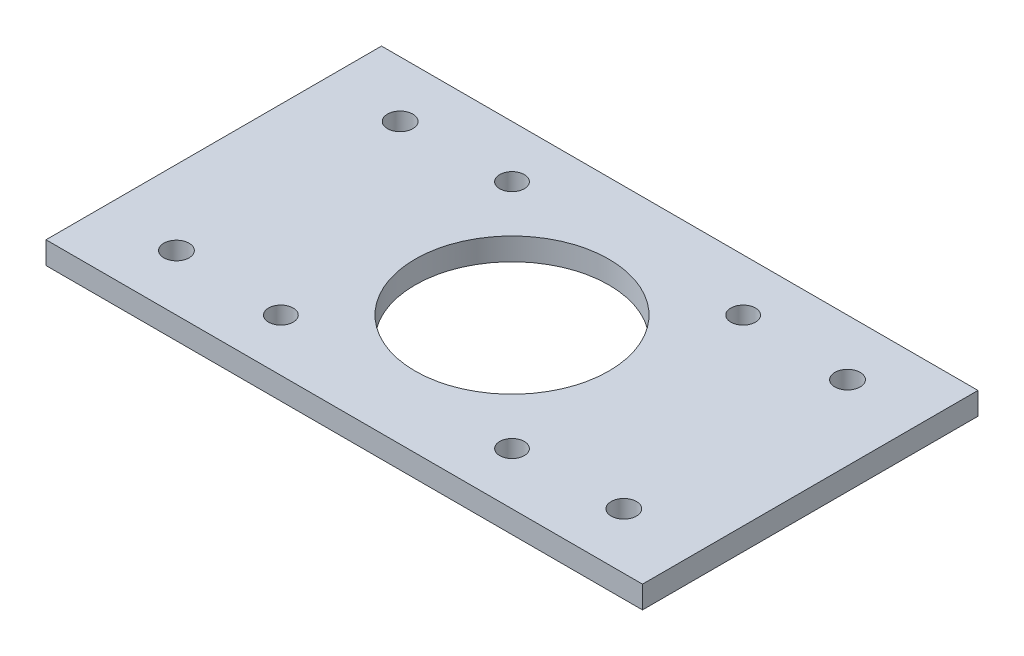
ISO-10303-21;
HEADER;
FILE_DESCRIPTION(('STEP AP214'),'2;1');
FILE_NAME('part.step','',(''),(''),'','','');
FILE_SCHEMA(('AUTOMOTIVE_DESIGN { 1 0 10303 214 1 1 1 1 }'));
ENDSEC;
DATA;
#1=APPLICATION_CONTEXT('core data for automotive mechanical design processes');
#2=APPLICATION_PROTOCOL_DEFINITION('international standard','automotive_design',2000,#1);
#3=PRODUCT_CONTEXT('',#1,'mechanical');
#4=PRODUCT('Part','Part','',(#3));
#5=PRODUCT_RELATED_PRODUCT_CATEGORY('part','',(#4));
#6=PRODUCT_DEFINITION_FORMATION('','',#4);
#7=PRODUCT_DEFINITION_CONTEXT('part definition',#1,'design');
#8=PRODUCT_DEFINITION('design','',#6,#7);
#9=PRODUCT_DEFINITION_SHAPE('','',#8);
#10=(LENGTH_UNIT() NAMED_UNIT(*) SI_UNIT(.MILLI.,.METRE.));
#11=(NAMED_UNIT(*) PLANE_ANGLE_UNIT() SI_UNIT($,.RADIAN.));
#12=(NAMED_UNIT(*) SI_UNIT($,.STERADIAN.) SOLID_ANGLE_UNIT());
#13=UNCERTAINTY_MEASURE_WITH_UNIT(LENGTH_MEASURE(1.E-05),#10,'distance_accuracy_value','');
#14=(GEOMETRIC_REPRESENTATION_CONTEXT(3) GLOBAL_UNCERTAINTY_ASSIGNED_CONTEXT((#13)) GLOBAL_UNIT_ASSIGNED_CONTEXT((#10,
#11,#12)) REPRESENTATION_CONTEXT('',''));
#15=CARTESIAN_POINT('',(0.,0.,0.));
#16=DIRECTION('',(0.,0.,1.));
#17=DIRECTION('',(1.,0.,0.));
#18=AXIS2_PLACEMENT_3D('',#15,#16,#17);
#19=CARTESIAN_POINT('',(-40.,3.,-22.5));
#20=DIRECTION('',(1.,0.,0.));
#21=DIRECTION('',(0.,0.,-1.));
#22=AXIS2_PLACEMENT_3D('',#19,#20,#21);
#23=PLANE('',#22);
#24=DIRECTION('',(0.,0.,1.));
#25=VECTOR('',#24,1.);
#26=CARTESIAN_POINT('',(-40.,0.,-22.5));
#27=LINE('',#26,#25);
#28=CARTESIAN_POINT('',(-40.,0.,-22.5));
#29=VERTEX_POINT('',#28);
#30=CARTESIAN_POINT('',(-40.,0.,22.5));
#31=VERTEX_POINT('',#30);
#32=EDGE_CURVE('E101',#29,#31,#27,.T.);
#33=ORIENTED_EDGE('',*,*,#32,.T.);
#34=DIRECTION('',(0.,-1.,0.));
#35=VECTOR('',#34,1.);
#36=CARTESIAN_POINT('',(-40.,3.,22.5));
#37=LINE('',#36,#35);
#38=CARTESIAN_POINT('',(-40.,3.,22.5));
#39=VERTEX_POINT('',#38);
#40=EDGE_CURVE('E11',#39,#31,#37,.T.);
#41=ORIENTED_EDGE('',*,*,#40,.F.);
#42=DIRECTION('',(0.,0.,1.));
#43=VECTOR('',#42,1.);
#44=CARTESIAN_POINT('',(-40.,3.,-22.5));
#45=LINE('',#44,#43);
#46=CARTESIAN_POINT('',(-40.,3.,-22.5));
#47=VERTEX_POINT('',#46);
#48=EDGE_CURVE('E88',#47,#39,#45,.T.);
#49=ORIENTED_EDGE('',*,*,#48,.F.);
#50=DIRECTION('',(0.,-1.,0.));
#51=VECTOR('',#50,1.);
#52=CARTESIAN_POINT('',(-40.,3.,-22.5));
#53=LINE('',#52,#51);
#54=EDGE_CURVE('E97',#47,#29,#53,.T.);
#55=ORIENTED_EDGE('',*,*,#54,.T.);
#56=EDGE_LOOP('',(#33,#41,#49,#55));
#57=FACE_BOUND('',#56,.T.);
#58=ADVANCED_FACE('F35',(#57),#23,.F.);
#59=CARTESIAN_POINT('',(40.,3.,22.5));
#60=DIRECTION('',(0.,0.,-1.));
#61=DIRECTION('',(-1.,0.,0.));
#62=AXIS2_PLACEMENT_3D('',#59,#60,#61);
#63=PLANE('',#62);
#64=DIRECTION('',(1.,0.,0.));
#65=VECTOR('',#64,1.);
#66=CARTESIAN_POINT('',(40.,0.,22.5));
#67=LINE('',#66,#65);
#68=CARTESIAN_POINT('',(40.,0.,22.5));
#69=VERTEX_POINT('',#68);
#70=EDGE_CURVE('E92',#31,#69,#67,.T.);
#71=ORIENTED_EDGE('',*,*,#70,.T.);
#72=DIRECTION('',(0.,-1.,0.));
#73=VECTOR('',#72,1.);
#74=CARTESIAN_POINT('',(40.,3.,22.5));
#75=LINE('',#74,#73);
#76=CARTESIAN_POINT('',(40.,3.,22.5));
#77=VERTEX_POINT('',#76);
#78=EDGE_CURVE('E44',#77,#69,#75,.T.);
#79=ORIENTED_EDGE('',*,*,#78,.F.);
#80=DIRECTION('',(1.,0.,0.));
#81=VECTOR('',#80,1.);
#82=CARTESIAN_POINT('',(40.,3.,22.5));
#83=LINE('',#82,#81);
#84=EDGE_CURVE('E83',#39,#77,#83,.T.);
#85=ORIENTED_EDGE('',*,*,#84,.F.);
#86=ORIENTED_EDGE('',*,*,#40,.T.);
#87=EDGE_LOOP('',(#71,#79,#85,#86));
#88=FACE_BOUND('',#87,.T.);
#89=ADVANCED_FACE('F91',(#88),#63,.F.);
#90=CARTESIAN_POINT('',(40.,3.,-22.5));
#91=DIRECTION('',(-1.,0.,0.));
#92=DIRECTION('',(0.,0.,1.));
#93=AXIS2_PLACEMENT_3D('',#90,#91,#92);
#94=PLANE('',#93);
#95=DIRECTION('',(0.,0.,-1.));
#96=VECTOR('',#95,1.);
#97=CARTESIAN_POINT('',(40.,0.,-22.5));
#98=LINE('',#97,#96);
#99=CARTESIAN_POINT('',(40.,0.,-22.5));
#100=VERTEX_POINT('',#99);
#101=EDGE_CURVE('E70',#69,#100,#98,.T.);
#102=ORIENTED_EDGE('',*,*,#101,.T.);
#103=DIRECTION('',(0.,-1.,0.));
#104=VECTOR('',#103,1.);
#105=CARTESIAN_POINT('',(40.,3.,-22.5));
#106=LINE('',#105,#104);
#107=CARTESIAN_POINT('',(40.,3.,-22.5));
#108=VERTEX_POINT('',#107);
#109=EDGE_CURVE('E93',#108,#100,#106,.T.);
#110=ORIENTED_EDGE('',*,*,#109,.F.);
#111=DIRECTION('',(0.,0.,-1.));
#112=VECTOR('',#111,1.);
#113=CARTESIAN_POINT('',(40.,3.,-22.5));
#114=LINE('',#113,#112);
#115=EDGE_CURVE('E86',#77,#108,#114,.T.);
#116=ORIENTED_EDGE('',*,*,#115,.F.);
#117=ORIENTED_EDGE('',*,*,#78,.T.);
#118=EDGE_LOOP('',(#102,#110,#116,#117));
#119=FACE_BOUND('',#118,.T.);
#120=ADVANCED_FACE('F95',(#119),#94,.F.);
#121=CARTESIAN_POINT('',(40.,3.,-22.5));
#122=DIRECTION('',(0.,0.,1.));
#123=DIRECTION('',(1.,0.,0.));
#124=AXIS2_PLACEMENT_3D('',#121,#122,#123);
#125=PLANE('',#124);
#126=DIRECTION('',(-1.,0.,0.));
#127=VECTOR('',#126,1.);
#128=CARTESIAN_POINT('',(40.,0.,-22.5));
#129=LINE('',#128,#127);
#130=EDGE_CURVE('E76',#100,#29,#129,.T.);
#131=ORIENTED_EDGE('',*,*,#130,.T.);
#132=ORIENTED_EDGE('',*,*,#54,.F.);
#133=DIRECTION('',(-1.,0.,0.));
#134=VECTOR('',#133,1.);
#135=CARTESIAN_POINT('',(40.,3.,-22.5));
#136=LINE('',#135,#134);
#137=EDGE_CURVE('E53',#108,#47,#136,.T.);
#138=ORIENTED_EDGE('',*,*,#137,.F.);
#139=ORIENTED_EDGE('',*,*,#109,.T.);
#140=EDGE_LOOP('',(#131,#132,#138,#139));
#141=FACE_BOUND('',#140,.T.);
#142=ADVANCED_FACE('F162',(#141),#125,.F.);
#143=CARTESIAN_POINT('',(0.,3.,0.));
#144=DIRECTION('',(0.,-1.,0.));
#145=DIRECTION('',(0.,0.,-1.));
#146=AXIS2_PLACEMENT_3D('',#143,#144,#145);
#147=PLANE('',#146);
#148=CARTESIAN_POINT('',(30.,3.,-15.));
#149=DIRECTION('',(0.,1.,0.));
#150=DIRECTION('',(0.,0.,-1.));
#151=AXIS2_PLACEMENT_3D('',#148,#149,#150);
#152=CIRCLE('',#151,1.7);
#153=CARTESIAN_POINT('',(30.,3.,-16.7));
#154=VERTEX_POINT('',#153);
#155=EDGE_CURVE('E294',#154,#154,#152,.T.);
#156=ORIENTED_EDGE('',*,*,#155,.F.);
#157=EDGE_LOOP('',(#156));
#158=FACE_BOUND('',#157,.T.);
#159=CARTESIAN_POINT('',(-30.,3.,15.));
#160=DIRECTION('',(0.,1.,0.));
#161=DIRECTION('',(0.,0.,-1.));
#162=AXIS2_PLACEMENT_3D('',#159,#160,#161);
#163=CIRCLE('',#162,1.7);
#164=CARTESIAN_POINT('',(-30.,3.,13.3));
#165=VERTEX_POINT('',#164);
#166=EDGE_CURVE('E295',#165,#165,#163,.T.);
#167=ORIENTED_EDGE('',*,*,#166,.F.);
#168=EDGE_LOOP('',(#167));
#169=FACE_BOUND('',#168,.T.);
#170=CARTESIAN_POINT('',(30.,3.,15.));
#171=DIRECTION('',(0.,1.,0.));
#172=DIRECTION('',(0.,0.,1.));
#173=AXIS2_PLACEMENT_3D('',#170,#171,#172);
#174=CIRCLE('',#173,1.7);
#175=CARTESIAN_POINT('',(30.,3.,16.7));
#176=VERTEX_POINT('',#175);
#177=EDGE_CURVE('E299',#176,#176,#174,.T.);
#178=ORIENTED_EDGE('',*,*,#177,.F.);
#179=EDGE_LOOP('',(#178));
#180=FACE_BOUND('',#179,.T.);
#181=CARTESIAN_POINT('',(-30.,3.,-15.));
#182=DIRECTION('',(0.,1.,0.));
#183=DIRECTION('',(0.,0.,1.));
#184=AXIS2_PLACEMENT_3D('',#181,#182,#183);
#185=CIRCLE('',#184,1.7);
#186=CARTESIAN_POINT('',(-30.,3.,-13.3));
#187=VERTEX_POINT('',#186);
#188=EDGE_CURVE('E119',#187,#187,#185,.T.);
#189=ORIENTED_EDGE('',*,*,#188,.F.);
#190=EDGE_LOOP('',(#189));
#191=FACE_BOUND('',#190,.T.);
#192=CARTESIAN_POINT('',(0.,3.,0.));
#193=DIRECTION('',(0.,1.,0.));
#194=DIRECTION('',(0.,0.,1.));
#195=AXIS2_PLACEMENT_3D('',#192,#193,#194);
#196=CIRCLE('',#195,13.);
#197=CARTESIAN_POINT('',(0.,3.,13.));
#198=VERTEX_POINT('',#197);
#199=EDGE_CURVE('E114',#198,#198,#196,.T.);
#200=ORIENTED_EDGE('',*,*,#199,.F.);
#201=EDGE_LOOP('',(#200));
#202=FACE_BOUND('',#201,.T.);
#203=CARTESIAN_POINT('',(15.5,3.,-15.5));
#204=DIRECTION('',(0.,1.,0.));
#205=DIRECTION('',(0.,0.,1.));
#206=AXIS2_PLACEMENT_3D('',#203,#204,#205);
#207=CIRCLE('',#206,1.65);
#208=CARTESIAN_POINT('',(15.5,3.,-13.85));
#209=VERTEX_POINT('',#208);
#210=EDGE_CURVE('E145',#209,#209,#207,.T.);
#211=ORIENTED_EDGE('',*,*,#210,.F.);
#212=EDGE_LOOP('',(#211));
#213=FACE_BOUND('',#212,.T.);
#214=CARTESIAN_POINT('',(-15.5,3.,15.5));
#215=DIRECTION('',(0.,1.,0.));
#216=DIRECTION('',(0.,0.,1.));
#217=AXIS2_PLACEMENT_3D('',#214,#215,#216);
#218=CIRCLE('',#217,1.65);
#219=CARTESIAN_POINT('',(-15.5,3.,17.15));
#220=VERTEX_POINT('',#219);
#221=EDGE_CURVE('E138',#220,#220,#218,.T.);
#222=ORIENTED_EDGE('',*,*,#221,.F.);
#223=EDGE_LOOP('',(#222));
#224=FACE_BOUND('',#223,.T.);
#225=CARTESIAN_POINT('',(15.5,3.,15.5));
#226=DIRECTION('',(0.,1.,0.));
#227=DIRECTION('',(0.,0.,1.));
#228=AXIS2_PLACEMENT_3D('',#225,#226,#227);
#229=CIRCLE('',#228,1.65);
#230=CARTESIAN_POINT('',(15.5,3.,17.15));
#231=VERTEX_POINT('',#230);
#232=EDGE_CURVE('E113',#231,#231,#229,.T.);
#233=ORIENTED_EDGE('',*,*,#232,.F.);
#234=EDGE_LOOP('',(#233));
#235=FACE_BOUND('',#234,.T.);
#236=CARTESIAN_POINT('',(-15.5,3.,-15.5));
#237=DIRECTION('',(0.,1.,0.));
#238=DIRECTION('',(0.,0.,1.));
#239=AXIS2_PLACEMENT_3D('',#236,#237,#238);
#240=CIRCLE('',#239,1.65);
#241=CARTESIAN_POINT('',(-15.5,3.,-13.85));
#242=VERTEX_POINT('',#241);
#243=EDGE_CURVE('E144',#242,#242,#240,.T.);
#244=ORIENTED_EDGE('',*,*,#243,.F.);
#245=EDGE_LOOP('',(#244));
#246=FACE_BOUND('',#245,.T.);
#247=ORIENTED_EDGE('',*,*,#48,.T.);
#248=ORIENTED_EDGE('',*,*,#84,.T.);
#249=ORIENTED_EDGE('',*,*,#115,.T.);
#250=ORIENTED_EDGE('',*,*,#137,.T.);
#251=EDGE_LOOP('',(#247,#248,#249,#250));
#252=FACE_BOUND('',#251,.T.);
#253=ADVANCED_FACE('F84',(#158,#169,#180,#191,#202,#213,#224,#235,#246,#252),#147,.F.);
#254=CARTESIAN_POINT('',(0.,0.,0.));
#255=DIRECTION('',(0.,-1.,0.));
#256=DIRECTION('',(0.,0.,-1.));
#257=AXIS2_PLACEMENT_3D('',#254,#255,#256);
#258=PLANE('',#257);
#259=CARTESIAN_POINT('',(30.,0.,-15.));
#260=DIRECTION('',(0.,-1.,0.));
#261=DIRECTION('',(0.,0.,-1.));
#262=AXIS2_PLACEMENT_3D('',#259,#260,#261);
#263=CIRCLE('',#262,1.7);
#264=CARTESIAN_POINT('',(30.,0.,-16.7));
#265=VERTEX_POINT('',#264);
#266=EDGE_CURVE('E38',#265,#265,#263,.T.);
#267=ORIENTED_EDGE('',*,*,#266,.F.);
#268=EDGE_LOOP('',(#267));
#269=FACE_BOUND('',#268,.T.);
#270=CARTESIAN_POINT('',(-30.,0.,15.));
#271=DIRECTION('',(0.,-1.,0.));
#272=DIRECTION('',(0.,0.,-1.));
#273=AXIS2_PLACEMENT_3D('',#270,#271,#272);
#274=CIRCLE('',#273,1.7);
#275=CARTESIAN_POINT('',(-30.,0.,13.3));
#276=VERTEX_POINT('',#275);
#277=EDGE_CURVE('E121',#276,#276,#274,.T.);
#278=ORIENTED_EDGE('',*,*,#277,.F.);
#279=EDGE_LOOP('',(#278));
#280=FACE_BOUND('',#279,.T.);
#281=CARTESIAN_POINT('',(30.,0.,15.));
#282=DIRECTION('',(0.,-1.,0.));
#283=DIRECTION('',(0.,0.,-1.));
#284=AXIS2_PLACEMENT_3D('',#281,#282,#283);
#285=CIRCLE('',#284,1.7);
#286=CARTESIAN_POINT('',(30.,0.,13.3));
#287=VERTEX_POINT('',#286);
#288=EDGE_CURVE('E118',#287,#287,#285,.T.);
#289=ORIENTED_EDGE('',*,*,#288,.F.);
#290=EDGE_LOOP('',(#289));
#291=FACE_BOUND('',#290,.T.);
#292=CARTESIAN_POINT('',(-30.,0.,-15.));
#293=DIRECTION('',(0.,-1.,0.));
#294=DIRECTION('',(0.,0.,-1.));
#295=AXIS2_PLACEMENT_3D('',#292,#293,#294);
#296=CIRCLE('',#295,1.7);
#297=CARTESIAN_POINT('',(-30.,0.,-16.7));
#298=VERTEX_POINT('',#297);
#299=EDGE_CURVE('E115',#298,#298,#296,.T.);
#300=ORIENTED_EDGE('',*,*,#299,.F.);
#301=EDGE_LOOP('',(#300));
#302=FACE_BOUND('',#301,.T.);
#303=CARTESIAN_POINT('',(0.,0.,0.));
#304=DIRECTION('',(0.,-1.,0.));
#305=DIRECTION('',(0.,0.,-1.));
#306=AXIS2_PLACEMENT_3D('',#303,#304,#305);
#307=CIRCLE('',#306,13.);
#308=CARTESIAN_POINT('',(0.,0.,-13.));
#309=VERTEX_POINT('',#308);
#310=EDGE_CURVE('E110',#309,#309,#307,.T.);
#311=ORIENTED_EDGE('',*,*,#310,.F.);
#312=EDGE_LOOP('',(#311));
#313=FACE_BOUND('',#312,.T.);
#314=CARTESIAN_POINT('',(15.5,0.,-15.5));
#315=DIRECTION('',(0.,1.,0.));
#316=DIRECTION('',(0.,0.,1.));
#317=AXIS2_PLACEMENT_3D('',#314,#315,#316);
#318=CIRCLE('',#317,1.65);
#319=CARTESIAN_POINT('',(15.5,0.,-13.85));
#320=VERTEX_POINT('',#319);
#321=EDGE_CURVE('E141',#320,#320,#318,.T.);
#322=ORIENTED_EDGE('',*,*,#321,.T.);
#323=EDGE_LOOP('',(#322));
#324=FACE_BOUND('',#323,.T.);
#325=CARTESIAN_POINT('',(-15.5,0.,15.5));
#326=DIRECTION('',(0.,1.,0.));
#327=DIRECTION('',(0.,0.,1.));
#328=AXIS2_PLACEMENT_3D('',#325,#326,#327);
#329=CIRCLE('',#328,1.65);
#330=CARTESIAN_POINT('',(-15.5,0.,17.15));
#331=VERTEX_POINT('',#330);
#332=EDGE_CURVE('E148',#331,#331,#329,.T.);
#333=ORIENTED_EDGE('',*,*,#332,.T.);
#334=EDGE_LOOP('',(#333));
#335=FACE_BOUND('',#334,.T.);
#336=CARTESIAN_POINT('',(15.5,0.,15.5));
#337=DIRECTION('',(0.,1.,0.));
#338=DIRECTION('',(0.,0.,1.));
#339=AXIS2_PLACEMENT_3D('',#336,#337,#338);
#340=CIRCLE('',#339,1.65);
#341=CARTESIAN_POINT('',(15.5,0.,17.15));
#342=VERTEX_POINT('',#341);
#343=EDGE_CURVE('E135',#342,#342,#340,.T.);
#344=ORIENTED_EDGE('',*,*,#343,.T.);
#345=EDGE_LOOP('',(#344));
#346=FACE_BOUND('',#345,.T.);
#347=CARTESIAN_POINT('',(-15.5,0.,-15.5));
#348=DIRECTION('',(0.,1.,0.));
#349=DIRECTION('',(0.,0.,1.));
#350=AXIS2_PLACEMENT_3D('',#347,#348,#349);
#351=CIRCLE('',#350,1.65);
#352=CARTESIAN_POINT('',(-15.5,0.,-13.85));
#353=VERTEX_POINT('',#352);
#354=EDGE_CURVE('E104',#353,#353,#351,.T.);
#355=ORIENTED_EDGE('',*,*,#354,.T.);
#356=EDGE_LOOP('',(#355));
#357=FACE_BOUND('',#356,.T.);
#358=ORIENTED_EDGE('',*,*,#32,.F.);
#359=ORIENTED_EDGE('',*,*,#130,.F.);
#360=ORIENTED_EDGE('',*,*,#101,.F.);
#361=ORIENTED_EDGE('',*,*,#70,.F.);
#362=EDGE_LOOP('',(#358,#359,#360,#361));
#363=FACE_BOUND('',#362,.T.);
#364=ADVANCED_FACE('F161',(#269,#280,#291,#302,#313,#324,#335,#346,#357,#363),#258,.T.);
#365=CARTESIAN_POINT('',(-15.5,0.,-15.5));
#366=DIRECTION('',(0.,1.,0.));
#367=DIRECTION('',(0.,0.,1.));
#368=AXIS2_PLACEMENT_3D('',#365,#366,#367);
#369=CYLINDRICAL_SURFACE('',#368,1.65);
#370=ORIENTED_EDGE('',*,*,#354,.F.);
#371=EDGE_LOOP('',(#370));
#372=FACE_BOUND('',#371,.T.);
#373=ORIENTED_EDGE('',*,*,#243,.T.);
#374=EDGE_LOOP('',(#373));
#375=FACE_BOUND('',#374,.T.);
#376=ADVANCED_FACE('F158',(#372,#375),#369,.F.);
#377=CARTESIAN_POINT('',(15.5,0.,15.5));
#378=DIRECTION('',(0.,1.,0.));
#379=DIRECTION('',(0.,0.,1.));
#380=AXIS2_PLACEMENT_3D('',#377,#378,#379);
#381=CYLINDRICAL_SURFACE('',#380,1.65);
#382=ORIENTED_EDGE('',*,*,#343,.F.);
#383=EDGE_LOOP('',(#382));
#384=FACE_BOUND('',#383,.T.);
#385=ORIENTED_EDGE('',*,*,#232,.T.);
#386=EDGE_LOOP('',(#385));
#387=FACE_BOUND('',#386,.T.);
#388=ADVANCED_FACE('F202',(#384,#387),#381,.F.);
#389=CARTESIAN_POINT('',(-15.5,0.,15.5));
#390=DIRECTION('',(0.,1.,0.));
#391=DIRECTION('',(0.,0.,1.));
#392=AXIS2_PLACEMENT_3D('',#389,#390,#391);
#393=CYLINDRICAL_SURFACE('',#392,1.65);
#394=ORIENTED_EDGE('',*,*,#332,.F.);
#395=EDGE_LOOP('',(#394));
#396=FACE_BOUND('',#395,.T.);
#397=ORIENTED_EDGE('',*,*,#221,.T.);
#398=EDGE_LOOP('',(#397));
#399=FACE_BOUND('',#398,.T.);
#400=ADVANCED_FACE('F212',(#396,#399),#393,.F.);
#401=CARTESIAN_POINT('',(15.5,0.,-15.5));
#402=DIRECTION('',(0.,1.,0.));
#403=DIRECTION('',(0.,0.,1.));
#404=AXIS2_PLACEMENT_3D('',#401,#402,#403);
#405=CYLINDRICAL_SURFACE('',#404,1.65);
#406=ORIENTED_EDGE('',*,*,#321,.F.);
#407=EDGE_LOOP('',(#406));
#408=FACE_BOUND('',#407,.T.);
#409=ORIENTED_EDGE('',*,*,#210,.T.);
#410=EDGE_LOOP('',(#409));
#411=FACE_BOUND('',#410,.T.);
#412=ADVANCED_FACE('F222',(#408,#411),#405,.F.);
#413=CARTESIAN_POINT('',(0.,-7.,0.));
#414=DIRECTION('',(0.,1.,0.));
#415=DIRECTION('',(0.,0.,1.));
#416=AXIS2_PLACEMENT_3D('',#413,#414,#415);
#417=CYLINDRICAL_SURFACE('',#416,13.);
#418=ORIENTED_EDGE('',*,*,#310,.T.);
#419=EDGE_LOOP('',(#418));
#420=FACE_BOUND('',#419,.T.);
#421=ORIENTED_EDGE('',*,*,#199,.T.);
#422=EDGE_LOOP('',(#421));
#423=FACE_BOUND('',#422,.T.);
#424=ADVANCED_FACE('F232',(#420,#423),#417,.F.);
#425=CARTESIAN_POINT('',(-30.,-7.,-15.));
#426=DIRECTION('',(0.,1.,0.));
#427=DIRECTION('',(0.,0.,1.));
#428=AXIS2_PLACEMENT_3D('',#425,#426,#427);
#429=CYLINDRICAL_SURFACE('',#428,1.7);
#430=ORIENTED_EDGE('',*,*,#299,.T.);
#431=EDGE_LOOP('',(#430));
#432=FACE_BOUND('',#431,.T.);
#433=ORIENTED_EDGE('',*,*,#188,.T.);
#434=EDGE_LOOP('',(#433));
#435=FACE_BOUND('',#434,.T.);
#436=ADVANCED_FACE('F241',(#432,#435),#429,.F.);
#437=CARTESIAN_POINT('',(30.,-7.,15.));
#438=DIRECTION('',(0.,1.,0.));
#439=DIRECTION('',(0.,0.,1.));
#440=AXIS2_PLACEMENT_3D('',#437,#438,#439);
#441=CYLINDRICAL_SURFACE('',#440,1.7);
#442=ORIENTED_EDGE('',*,*,#288,.T.);
#443=EDGE_LOOP('',(#442));
#444=FACE_BOUND('',#443,.T.);
#445=ORIENTED_EDGE('',*,*,#177,.T.);
#446=EDGE_LOOP('',(#445));
#447=FACE_BOUND('',#446,.T.);
#448=ADVANCED_FACE('F260',(#444,#447),#441,.F.);
#449=CARTESIAN_POINT('',(-30.,-7.,15.));
#450=DIRECTION('',(0.,1.,0.));
#451=DIRECTION('',(0.,0.,1.));
#452=AXIS2_PLACEMENT_3D('',#449,#450,#451);
#453=CYLINDRICAL_SURFACE('',#452,1.7);
#454=ORIENTED_EDGE('',*,*,#277,.T.);
#455=EDGE_LOOP('',(#454));
#456=FACE_BOUND('',#455,.T.);
#457=ORIENTED_EDGE('',*,*,#166,.T.);
#458=EDGE_LOOP('',(#457));
#459=FACE_BOUND('',#458,.T.);
#460=ADVANCED_FACE('F270',(#456,#459),#453,.F.);
#461=CARTESIAN_POINT('',(30.,-7.,-15.));
#462=DIRECTION('',(0.,1.,0.));
#463=DIRECTION('',(0.,0.,1.));
#464=AXIS2_PLACEMENT_3D('',#461,#462,#463);
#465=CYLINDRICAL_SURFACE('',#464,1.7);
#466=ORIENTED_EDGE('',*,*,#266,.T.);
#467=EDGE_LOOP('',(#466));
#468=FACE_BOUND('',#467,.T.);
#469=ORIENTED_EDGE('',*,*,#155,.T.);
#470=EDGE_LOOP('',(#469));
#471=FACE_BOUND('',#470,.T.);
#472=ADVANCED_FACE('F280',(#468,#471),#465,.F.);
#473=CLOSED_SHELL('',(#58,#89,#120,#142,#253,#364,#376,#388,#400,#412,#424,#436,#448,#460,#472));
#474=MANIFOLD_SOLID_BREP('B2',#473);
#475=ADVANCED_BREP_SHAPE_REPRESENTATION('',(#18,#474),#14);
#476=SHAPE_DEFINITION_REPRESENTATION(#9,#475);
ENDSEC;
END-ISO-10303-21;
